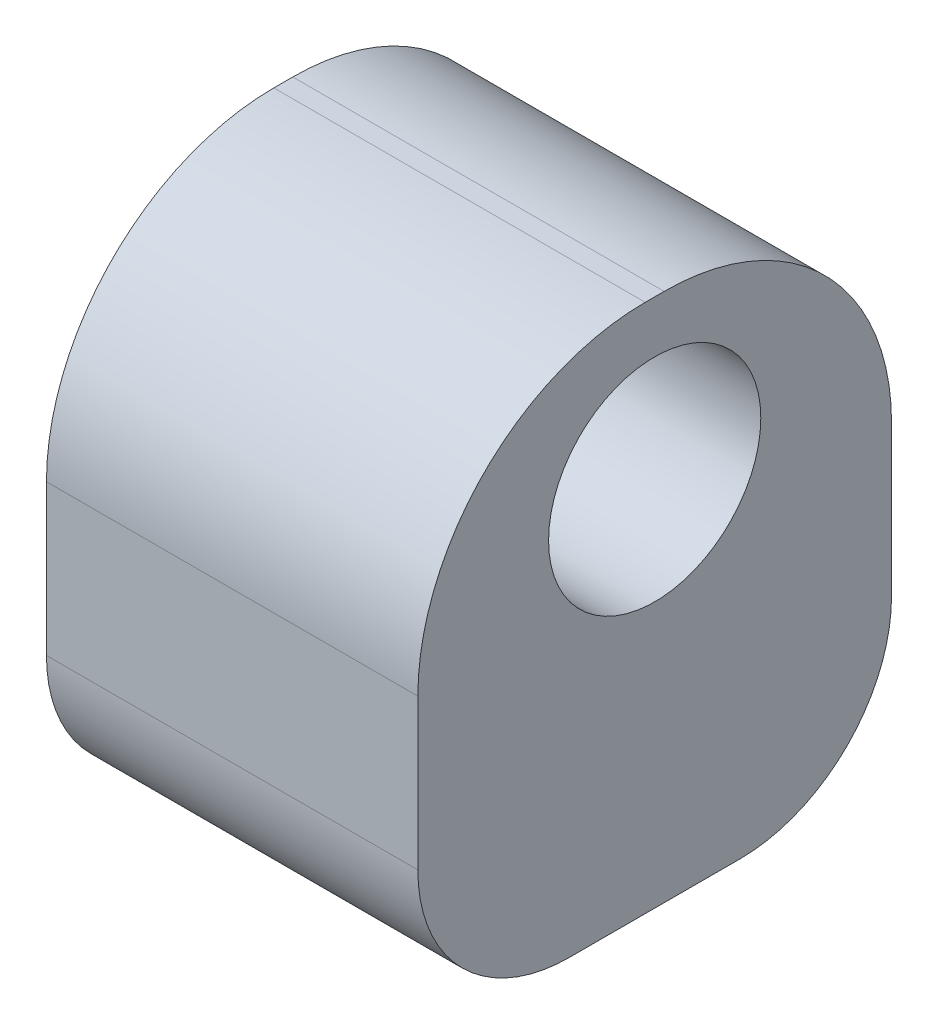
ISO-10303-21;
HEADER;
FILE_DESCRIPTION(('STEP AP214'),'2;1');
FILE_NAME('part.step','',(''),(''),'','','');
FILE_SCHEMA(('AUTOMOTIVE_DESIGN { 1 0 10303 214 1 1 1 1 }'));
ENDSEC;
DATA;
#1=APPLICATION_CONTEXT('core data for automotive mechanical design processes');
#2=APPLICATION_PROTOCOL_DEFINITION('international standard','automotive_design',2000,#1);
#3=PRODUCT_CONTEXT('',#1,'mechanical');
#4=PRODUCT('Part','Part','',(#3));
#5=PRODUCT_RELATED_PRODUCT_CATEGORY('part','',(#4));
#6=PRODUCT_DEFINITION_FORMATION('','',#4);
#7=PRODUCT_DEFINITION_CONTEXT('part definition',#1,'design');
#8=PRODUCT_DEFINITION('design','',#6,#7);
#9=PRODUCT_DEFINITION_SHAPE('','',#8);
#10=(LENGTH_UNIT() NAMED_UNIT(*) SI_UNIT(.MILLI.,.METRE.));
#11=(NAMED_UNIT(*) PLANE_ANGLE_UNIT() SI_UNIT($,.RADIAN.));
#12=(NAMED_UNIT(*) SI_UNIT($,.STERADIAN.) SOLID_ANGLE_UNIT());
#13=UNCERTAINTY_MEASURE_WITH_UNIT(LENGTH_MEASURE(1.E-05),#10,'distance_accuracy_value','');
#14=(GEOMETRIC_REPRESENTATION_CONTEXT(3) GLOBAL_UNCERTAINTY_ASSIGNED_CONTEXT((#13)) GLOBAL_UNIT_ASSIGNED_CONTEXT((#10,
#11,#12)) REPRESENTATION_CONTEXT('',''));
#15=CARTESIAN_POINT('',(0.,0.,0.));
#16=DIRECTION('',(0.,0.,1.));
#17=DIRECTION('',(1.,0.,0.));
#18=AXIS2_PLACEMENT_3D('',#15,#16,#17);
#19=CARTESIAN_POINT('',(0.,-44.45,4.7625));
#20=DIRECTION('',(1.,0.,0.));
#21=DIRECTION('',(0.,0.,-1.));
#22=AXIS2_PLACEMENT_3D('',#19,#20,#21);
#23=CYLINDRICAL_SURFACE('',#22,1.905);
#24=CARTESIAN_POINT('',(0.,-44.45,4.7625));
#25=DIRECTION('',(1.,0.,0.));
#26=DIRECTION('',(0.,0.,-1.));
#27=AXIS2_PLACEMENT_3D('',#24,#25,#26);
#28=CIRCLE('',#27,1.905);
#29=CARTESIAN_POINT('',(0.,-44.45,2.8575));
#30=VERTEX_POINT('',#29);
#31=EDGE_CURVE('E153',#30,#30,#28,.T.);
#32=ORIENTED_EDGE('',*,*,#31,.F.);
#33=EDGE_LOOP('',(#32));
#34=FACE_BOUND('',#33,.T.);
#35=CARTESIAN_POINT('',(7.366,-44.45,4.7625));
#36=DIRECTION('',(1.,0.,0.));
#37=DIRECTION('',(0.,0.,-1.));
#38=AXIS2_PLACEMENT_3D('',#35,#36,#37);
#39=CIRCLE('',#38,1.905);
#40=CARTESIAN_POINT('',(7.366,-44.45,2.8575));
#41=VERTEX_POINT('',#40);
#42=EDGE_CURVE('E154',#41,#41,#39,.F.);
#43=ORIENTED_EDGE('',*,*,#42,.F.);
#44=EDGE_LOOP('',(#43));
#45=FACE_BOUND('',#44,.T.);
#46=ADVANCED_FACE('F41',(#34,#45),#23,.F.);
#47=CARTESIAN_POINT('',(12.446,0.,0.));
#48=DIRECTION('',(1.,0.,0.));
#49=DIRECTION('',(0.,0.,-1.));
#50=AXIS2_PLACEMENT_3D('',#47,#48,#49);
#51=PLANE('',#50);
#52=DIRECTION('',(0.,0.,1.));
#53=VECTOR('',#52,1.);
#54=CARTESIAN_POINT('',(12.446,-56.896,0.));
#55=LINE('',#54,#53);
#56=CARTESIAN_POINT('',(12.446,-56.896,1.905));
#57=VERTEX_POINT('',#56);
#58=CARTESIAN_POINT('',(12.446,-56.896,7.61999999999999));
#59=VERTEX_POINT('',#58);
#60=EDGE_CURVE('E140',#57,#59,#55,.T.);
#61=ORIENTED_EDGE('',*,*,#60,.F.);
#62=CARTESIAN_POINT('',(12.446,-51.816,1.905));
#63=DIRECTION('',(1.,0.,0.));
#64=DIRECTION('',(0.,0.,-1.));
#65=AXIS2_PLACEMENT_3D('',#62,#63,#64);
#66=CIRCLE('',#65,5.08);
#67=CARTESIAN_POINT('',(12.446,-51.816,-3.175));
#68=VERTEX_POINT('',#67);
#69=EDGE_CURVE('E180',#57,#68,#66,.T.);
#70=ORIENTED_EDGE('',*,*,#69,.T.);
#71=DIRECTION('',(0.,-1.,0.));
#72=VECTOR('',#71,1.);
#73=CARTESIAN_POINT('',(12.446,0.,-3.175));
#74=LINE('',#73,#72);
#75=CARTESIAN_POINT('',(12.446,-46.7730110941488,-3.175));
#76=VERTEX_POINT('',#75);
#77=EDGE_CURVE('E194',#76,#68,#74,.T.);
#78=ORIENTED_EDGE('',*,*,#77,.F.);
#79=CARTESIAN_POINT('',(12.446,-46.7730110941488,4.445));
#80=DIRECTION('',(1.,0.,0.));
#81=DIRECTION('',(0.,0.,-1.));
#82=AXIS2_PLACEMENT_3D('',#79,#80,#81);
#83=CIRCLE('',#82,7.62);
#84=CARTESIAN_POINT('',(12.446,-39.1530110941488,4.445));
#85=VERTEX_POINT('',#84);
#86=EDGE_CURVE('E118',#76,#85,#83,.T.);
#87=ORIENTED_EDGE('',*,*,#86,.T.);
#88=DIRECTION('',(0.,0.,-1.));
#89=VECTOR('',#88,1.);
#90=CARTESIAN_POINT('',(12.446,-39.1530110941488,7.97752892318007));
#91=LINE('',#90,#89);
#92=CARTESIAN_POINT('',(12.446,-39.1530110941488,5.07999999999999));
#93=VERTEX_POINT('',#92);
#94=EDGE_CURVE('E123',#93,#85,#91,.T.);
#95=ORIENTED_EDGE('',*,*,#94,.F.);
#96=CARTESIAN_POINT('',(12.446,-46.7730110941488,5.07999999999999));
#97=DIRECTION('',(1.,0.,0.));
#98=DIRECTION('',(0.,0.,-1.));
#99=AXIS2_PLACEMENT_3D('',#96,#97,#98);
#100=CIRCLE('',#99,7.62);
#101=CARTESIAN_POINT('',(12.446,-46.7730110941488,12.7));
#102=VERTEX_POINT('',#101);
#103=EDGE_CURVE('E109',#93,#102,#100,.T.);
#104=ORIENTED_EDGE('',*,*,#103,.T.);
#105=DIRECTION('',(0.,1.,0.));
#106=VECTOR('',#105,1.);
#107=CARTESIAN_POINT('',(12.446,0.,12.7));
#108=LINE('',#107,#106);
#109=CARTESIAN_POINT('',(12.446,-51.816,12.7));
#110=VERTEX_POINT('',#109);
#111=EDGE_CURVE('E137',#110,#102,#108,.T.);
#112=ORIENTED_EDGE('',*,*,#111,.F.);
#113=CARTESIAN_POINT('',(12.446,-51.816,7.61999999999999));
#114=DIRECTION('',(1.,0.,0.));
#115=DIRECTION('',(0.,0.,-1.));
#116=AXIS2_PLACEMENT_3D('',#113,#114,#115);
#117=CIRCLE('',#116,5.08);
#118=EDGE_CURVE('E174',#110,#59,#117,.T.);
#119=ORIENTED_EDGE('',*,*,#118,.T.);
#120=EDGE_LOOP('',(#61,#70,#78,#87,#95,#104,#112,#119));
#121=FACE_BOUND('',#120,.T.);
#122=CARTESIAN_POINT('',(12.446,-44.45,4.7625));
#123=DIRECTION('',(1.,0.,0.));
#124=DIRECTION('',(0.,0.,-1.));
#125=AXIS2_PLACEMENT_3D('',#122,#123,#124);
#126=CIRCLE('',#125,3.556);
#127=CARTESIAN_POINT('',(12.446,-44.45,1.2065));
#128=VERTEX_POINT('',#127);
#129=EDGE_CURVE('E143',#128,#128,#126,.T.);
#130=ORIENTED_EDGE('',*,*,#129,.F.);
#131=EDGE_LOOP('',(#130));
#132=FACE_BOUND('',#131,.T.);
#133=ADVANCED_FACE('F131',(#121,#132),#51,.T.);
#134=CARTESIAN_POINT('',(0.,0.,0.));
#135=DIRECTION('',(1.,0.,0.));
#136=DIRECTION('',(0.,0.,-1.));
#137=AXIS2_PLACEMENT_3D('',#134,#135,#136);
#138=PLANE('',#137);
#139=DIRECTION('',(0.,1.,0.));
#140=VECTOR('',#139,1.);
#141=CARTESIAN_POINT('',(0.,0.,-3.175));
#142=LINE('',#141,#140);
#143=CARTESIAN_POINT('',(0.,-51.816,-3.175));
#144=VERTEX_POINT('',#143);
#145=CARTESIAN_POINT('',(0.,-46.7730110941488,-3.175));
#146=VERTEX_POINT('',#145);
#147=EDGE_CURVE('E183',#144,#146,#142,.T.);
#148=ORIENTED_EDGE('',*,*,#147,.F.);
#149=CARTESIAN_POINT('',(0.,-51.816,1.905));
#150=DIRECTION('',(1.,0.,0.));
#151=DIRECTION('',(0.,0.,-1.));
#152=AXIS2_PLACEMENT_3D('',#149,#150,#151);
#153=CIRCLE('',#152,5.08);
#154=CARTESIAN_POINT('',(0.,-56.896,1.905));
#155=VERTEX_POINT('',#154);
#156=EDGE_CURVE('E47',#144,#155,#153,.F.);
#157=ORIENTED_EDGE('',*,*,#156,.T.);
#158=DIRECTION('',(0.,0.,1.));
#159=VECTOR('',#158,1.);
#160=CARTESIAN_POINT('',(0.,-56.896,0.));
#161=LINE('',#160,#159);
#162=CARTESIAN_POINT('',(0.,-56.896,7.61999999999999));
#163=VERTEX_POINT('',#162);
#164=EDGE_CURVE('E141',#155,#163,#161,.T.);
#165=ORIENTED_EDGE('',*,*,#164,.T.);
#166=CARTESIAN_POINT('',(0.,-51.816,7.61999999999999));
#167=DIRECTION('',(1.,0.,0.));
#168=DIRECTION('',(0.,0.,-1.));
#169=AXIS2_PLACEMENT_3D('',#166,#167,#168);
#170=CIRCLE('',#169,5.08);
#171=CARTESIAN_POINT('',(0.,-51.816,12.7));
#172=VERTEX_POINT('',#171);
#173=EDGE_CURVE('E57',#163,#172,#170,.F.);
#174=ORIENTED_EDGE('',*,*,#173,.T.);
#175=DIRECTION('',(0.,-1.,0.));
#176=VECTOR('',#175,1.);
#177=CARTESIAN_POINT('',(0.,0.,12.7));
#178=LINE('',#177,#176);
#179=CARTESIAN_POINT('',(0.,-46.7730110941488,12.7));
#180=VERTEX_POINT('',#179);
#181=EDGE_CURVE('E132',#180,#172,#178,.T.);
#182=ORIENTED_EDGE('',*,*,#181,.F.);
#183=CARTESIAN_POINT('',(0.,-46.7730110941488,5.07999999999999));
#184=DIRECTION('',(1.,0.,0.));
#185=DIRECTION('',(0.,0.,-1.));
#186=AXIS2_PLACEMENT_3D('',#183,#184,#185);
#187=CIRCLE('',#186,7.62);
#188=CARTESIAN_POINT('',(0.,-39.1530110941488,5.07999999999999));
#189=VERTEX_POINT('',#188);
#190=EDGE_CURVE('E164',#180,#189,#187,.F.);
#191=ORIENTED_EDGE('',*,*,#190,.T.);
#192=DIRECTION('',(0.,0.,-1.));
#193=VECTOR('',#192,1.);
#194=CARTESIAN_POINT('',(0.,-39.1530110941488,7.97752892318007));
#195=LINE('',#194,#193);
#196=CARTESIAN_POINT('',(0.,-39.1530110941488,4.445));
#197=VERTEX_POINT('',#196);
#198=EDGE_CURVE('E130',#189,#197,#195,.T.);
#199=ORIENTED_EDGE('',*,*,#198,.T.);
#200=CARTESIAN_POINT('',(0.,-46.7730110941488,4.445));
#201=DIRECTION('',(1.,0.,0.));
#202=DIRECTION('',(0.,0.,-1.));
#203=AXIS2_PLACEMENT_3D('',#200,#201,#202);
#204=CIRCLE('',#203,7.62);
#205=EDGE_CURVE('E162',#197,#146,#204,.F.);
#206=ORIENTED_EDGE('',*,*,#205,.T.);
#207=EDGE_LOOP('',(#148,#157,#165,#174,#182,#191,#199,#206));
#208=FACE_BOUND('',#207,.T.);
#209=ORIENTED_EDGE('',*,*,#31,.T.);
#210=EDGE_LOOP('',(#209));
#211=FACE_BOUND('',#210,.T.);
#212=ADVANCED_FACE('F185',(#208,#211),#138,.F.);
#213=CARTESIAN_POINT('',(7.366,-44.45,4.7625));
#214=DIRECTION('',(1.,0.,0.));
#215=DIRECTION('',(0.,0.,-1.));
#216=AXIS2_PLACEMENT_3D('',#213,#214,#215);
#217=PLANE('',#216);
#218=CARTESIAN_POINT('',(7.366,-44.45,4.7625));
#219=DIRECTION('',(1.,0.,0.));
#220=DIRECTION('',(0.,0.,-1.));
#221=AXIS2_PLACEMENT_3D('',#218,#219,#220);
#222=CIRCLE('',#221,3.556);
#223=CARTESIAN_POINT('',(7.366,-44.45,1.2065));
#224=VERTEX_POINT('',#223);
#225=EDGE_CURVE('E150',#224,#224,#222,.T.);
#226=ORIENTED_EDGE('',*,*,#225,.T.);
#227=EDGE_LOOP('',(#226));
#228=FACE_BOUND('',#227,.T.);
#229=ORIENTED_EDGE('',*,*,#42,.T.);
#230=EDGE_LOOP('',(#229));
#231=FACE_BOUND('',#230,.T.);
#232=ADVANCED_FACE('F221',(#228,#231),#217,.T.);
#233=CARTESIAN_POINT('',(7.366,-44.45,4.7625));
#234=DIRECTION('',(1.,0.,0.));
#235=DIRECTION('',(0.,0.,-1.));
#236=AXIS2_PLACEMENT_3D('',#233,#234,#235);
#237=CYLINDRICAL_SURFACE('',#236,3.556);
#238=ORIENTED_EDGE('',*,*,#225,.F.);
#239=EDGE_LOOP('',(#238));
#240=FACE_BOUND('',#239,.T.);
#241=ORIENTED_EDGE('',*,*,#129,.T.);
#242=EDGE_LOOP('',(#241));
#243=FACE_BOUND('',#242,.T.);
#244=ADVANCED_FACE('F219',(#240,#243),#237,.F.);
#245=CARTESIAN_POINT('',(0.,-56.896,0.));
#246=DIRECTION('',(0.,1.,0.));
#247=DIRECTION('',(0.,0.,1.));
#248=AXIS2_PLACEMENT_3D('',#245,#246,#247);
#249=PLANE('',#248);
#250=ORIENTED_EDGE('',*,*,#164,.F.);
#251=DIRECTION('',(1.,0.,0.));
#252=VECTOR('',#251,1.);
#253=CARTESIAN_POINT('',(0.,-56.896,1.905));
#254=LINE('',#253,#252);
#255=EDGE_CURVE('E175',#155,#57,#254,.T.);
#256=ORIENTED_EDGE('',*,*,#255,.T.);
#257=ORIENTED_EDGE('',*,*,#60,.T.);
#258=DIRECTION('',(1.,0.,0.));
#259=VECTOR('',#258,1.);
#260=CARTESIAN_POINT('',(0.,-56.896,7.61999999999999));
#261=LINE('',#260,#259);
#262=EDGE_CURVE('E167',#59,#163,#261,.F.);
#263=ORIENTED_EDGE('',*,*,#262,.T.);
#264=EDGE_LOOP('',(#250,#256,#257,#263));
#265=FACE_BOUND('',#264,.T.);
#266=ADVANCED_FACE('F189',(#265),#249,.F.);
#267=CARTESIAN_POINT('',(0.,-39.1530110941488,7.97752892318007));
#268=DIRECTION('',(0.,-1.,0.));
#269=DIRECTION('',(0.,0.,-1.));
#270=AXIS2_PLACEMENT_3D('',#267,#268,#269);
#271=PLANE('',#270);
#272=ORIENTED_EDGE('',*,*,#198,.F.);
#273=DIRECTION('',(1.,0.,0.));
#274=VECTOR('',#273,1.);
#275=CARTESIAN_POINT('',(0.,-39.1530110941488,5.07999999999999));
#276=LINE('',#275,#274);
#277=EDGE_CURVE('E112',#189,#93,#276,.T.);
#278=ORIENTED_EDGE('',*,*,#277,.T.);
#279=ORIENTED_EDGE('',*,*,#94,.T.);
#280=DIRECTION('',(1.,0.,0.));
#281=VECTOR('',#280,1.);
#282=CARTESIAN_POINT('',(0.,-39.1530110941488,4.445));
#283=LINE('',#282,#281);
#284=EDGE_CURVE('E128',#85,#197,#283,.F.);
#285=ORIENTED_EDGE('',*,*,#284,.T.);
#286=EDGE_LOOP('',(#272,#278,#279,#285));
#287=FACE_BOUND('',#286,.T.);
#288=ADVANCED_FACE('F121',(#287),#271,.F.);
#289=CARTESIAN_POINT('',(-18.360702284623,0.,12.7));
#290=DIRECTION('',(0.,0.,-1.));
#291=DIRECTION('',(-1.,0.,0.));
#292=AXIS2_PLACEMENT_3D('',#289,#290,#291);
#293=PLANE('',#292);
#294=ORIENTED_EDGE('',*,*,#181,.T.);
#295=DIRECTION('',(1.,0.,0.));
#296=VECTOR('',#295,1.);
#297=CARTESIAN_POINT('',(-18.360702284623,-51.816,12.7));
#298=LINE('',#297,#296);
#299=EDGE_CURVE('E11',#172,#110,#298,.T.);
#300=ORIENTED_EDGE('',*,*,#299,.T.);
#301=ORIENTED_EDGE('',*,*,#111,.T.);
#302=DIRECTION('',(1.,0.,0.));
#303=VECTOR('',#302,1.);
#304=CARTESIAN_POINT('',(-18.360702284623,-46.7730110941488,12.7));
#305=LINE('',#304,#303);
#306=EDGE_CURVE('E114',#102,#180,#305,.F.);
#307=ORIENTED_EDGE('',*,*,#306,.T.);
#308=EDGE_LOOP('',(#294,#300,#301,#307));
#309=FACE_BOUND('',#308,.T.);
#310=ADVANCED_FACE('F196',(#309),#293,.F.);
#311=CARTESIAN_POINT('',(-18.360702284623,0.,-3.175));
#312=DIRECTION('',(0.,0.,1.));
#313=DIRECTION('',(1.,0.,0.));
#314=AXIS2_PLACEMENT_3D('',#311,#312,#313);
#315=PLANE('',#314);
#316=ORIENTED_EDGE('',*,*,#77,.T.);
#317=DIRECTION('',(1.,0.,0.));
#318=VECTOR('',#317,1.);
#319=CARTESIAN_POINT('',(-18.360702284623,-51.816,-3.175));
#320=LINE('',#319,#318);
#321=EDGE_CURVE('E63',#68,#144,#320,.F.);
#322=ORIENTED_EDGE('',*,*,#321,.T.);
#323=ORIENTED_EDGE('',*,*,#147,.T.);
#324=DIRECTION('',(1.,0.,0.));
#325=VECTOR('',#324,1.);
#326=CARTESIAN_POINT('',(-18.360702284623,-46.7730110941488,-3.175));
#327=LINE('',#326,#325);
#328=EDGE_CURVE('E170',#146,#76,#327,.T.);
#329=ORIENTED_EDGE('',*,*,#328,.T.);
#330=EDGE_LOOP('',(#316,#322,#323,#329));
#331=FACE_BOUND('',#330,.T.);
#332=ADVANCED_FACE('F191',(#331),#315,.F.);
#333=CARTESIAN_POINT('',(0.,-46.7730110941488,5.07999999999999));
#334=DIRECTION('',(1.,0.,0.));
#335=DIRECTION('',(0.,0.,-1.));
#336=AXIS2_PLACEMENT_3D('',#333,#334,#335);
#337=CYLINDRICAL_SURFACE('',#336,7.62);
#338=ORIENTED_EDGE('',*,*,#190,.F.);
#339=ORIENTED_EDGE('',*,*,#306,.F.);
#340=ORIENTED_EDGE('',*,*,#103,.F.);
#341=ORIENTED_EDGE('',*,*,#277,.F.);
#342=EDGE_LOOP('',(#338,#339,#340,#341));
#343=FACE_BOUND('',#342,.T.);
#344=ADVANCED_FACE('F113',(#343),#337,.T.);
#345=CARTESIAN_POINT('',(-18.360702284623,-46.7730110941488,4.445));
#346=DIRECTION('',(1.,0.,0.));
#347=DIRECTION('',(0.,0.,-1.));
#348=AXIS2_PLACEMENT_3D('',#345,#346,#347);
#349=CYLINDRICAL_SURFACE('',#348,7.62);
#350=ORIENTED_EDGE('',*,*,#205,.F.);
#351=ORIENTED_EDGE('',*,*,#284,.F.);
#352=ORIENTED_EDGE('',*,*,#86,.F.);
#353=ORIENTED_EDGE('',*,*,#328,.F.);
#354=EDGE_LOOP('',(#350,#351,#352,#353));
#355=FACE_BOUND('',#354,.T.);
#356=ADVANCED_FACE('F202',(#355),#349,.T.);
#357=CARTESIAN_POINT('',(0.,-51.816,1.905));
#358=DIRECTION('',(1.,0.,0.));
#359=DIRECTION('',(0.,0.,-1.));
#360=AXIS2_PLACEMENT_3D('',#357,#358,#359);
#361=CYLINDRICAL_SURFACE('',#360,5.08);
#362=ORIENTED_EDGE('',*,*,#156,.F.);
#363=ORIENTED_EDGE('',*,*,#321,.F.);
#364=ORIENTED_EDGE('',*,*,#69,.F.);
#365=ORIENTED_EDGE('',*,*,#255,.F.);
#366=EDGE_LOOP('',(#362,#363,#364,#365));
#367=FACE_BOUND('',#366,.T.);
#368=ADVANCED_FACE('F188',(#367),#361,.T.);
#369=CARTESIAN_POINT('',(-18.360702284623,-51.816,7.61999999999999));
#370=DIRECTION('',(1.,0.,0.));
#371=DIRECTION('',(0.,0.,-1.));
#372=AXIS2_PLACEMENT_3D('',#369,#370,#371);
#373=CYLINDRICAL_SURFACE('',#372,5.08);
#374=ORIENTED_EDGE('',*,*,#173,.F.);
#375=ORIENTED_EDGE('',*,*,#262,.F.);
#376=ORIENTED_EDGE('',*,*,#118,.F.);
#377=ORIENTED_EDGE('',*,*,#299,.F.);
#378=EDGE_LOOP('',(#374,#375,#376,#377));
#379=FACE_BOUND('',#378,.T.);
#380=ADVANCED_FACE('F43',(#379),#373,.T.);
#381=CLOSED_SHELL('',(#46,#133,#212,#232,#244,#266,#288,#310,#332,#344,#356,#368,#380));
#382=MANIFOLD_SOLID_BREP('B2',#381);
#383=ADVANCED_BREP_SHAPE_REPRESENTATION('',(#18,#382),#14);
#384=SHAPE_DEFINITION_REPRESENTATION(#9,#383);
ENDSEC;
END-ISO-10303-21;
